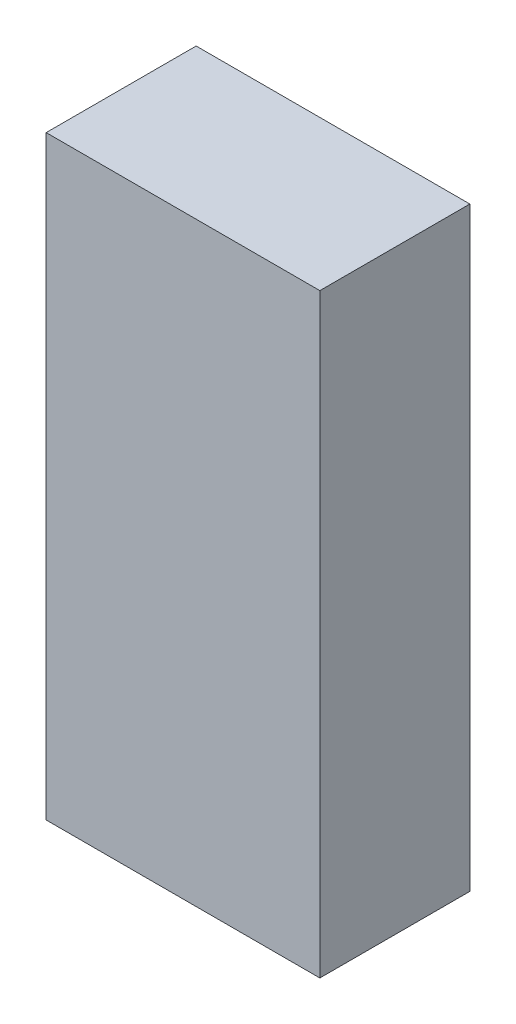
ISO-10303-21;
HEADER;
FILE_DESCRIPTION(('STEP AP214'),'2;1');
FILE_NAME('part.step','',(''),(''),'','','');
FILE_SCHEMA(('AUTOMOTIVE_DESIGN { 1 0 10303 214 1 1 1 1 }'));
ENDSEC;
DATA;
#1=APPLICATION_CONTEXT('core data for automotive mechanical design processes');
#2=APPLICATION_PROTOCOL_DEFINITION('international standard','automotive_design',2000,#1);
#3=PRODUCT_CONTEXT('',#1,'mechanical');
#4=PRODUCT('Part','Part','',(#3));
#5=PRODUCT_RELATED_PRODUCT_CATEGORY('part','',(#4));
#6=PRODUCT_DEFINITION_FORMATION('','',#4);
#7=PRODUCT_DEFINITION_CONTEXT('part definition',#1,'design');
#8=PRODUCT_DEFINITION('design','',#6,#7);
#9=PRODUCT_DEFINITION_SHAPE('','',#8);
#10=(LENGTH_UNIT() NAMED_UNIT(*) SI_UNIT(.MILLI.,.METRE.));
#11=(NAMED_UNIT(*) PLANE_ANGLE_UNIT() SI_UNIT($,.RADIAN.));
#12=(NAMED_UNIT(*) SI_UNIT($,.STERADIAN.) SOLID_ANGLE_UNIT());
#13=UNCERTAINTY_MEASURE_WITH_UNIT(LENGTH_MEASURE(1.E-05),#10,'distance_accuracy_value','');
#14=(GEOMETRIC_REPRESENTATION_CONTEXT(3) GLOBAL_UNCERTAINTY_ASSIGNED_CONTEXT((#13)) GLOBAL_UNIT_ASSIGNED_CONTEXT((#10,
#11,#12)) REPRESENTATION_CONTEXT('',''));
#15=CARTESIAN_POINT('',(0.,0.,0.));
#16=DIRECTION('',(0.,0.,1.));
#17=DIRECTION('',(1.,0.,0.));
#18=AXIS2_PLACEMENT_3D('',#15,#16,#17);
#19=CARTESIAN_POINT('',(8.85,38.5,4.85));
#20=DIRECTION('',(-1.,0.,0.));
#21=DIRECTION('',(0.,0.,1.));
#22=AXIS2_PLACEMENT_3D('',#19,#20,#21);
#23=PLANE('',#22);
#24=DIRECTION('',(0.,0.,-1.));
#25=VECTOR('',#24,1.);
#26=CARTESIAN_POINT('',(8.85,0.,4.85));
#27=LINE('',#26,#25);
#28=CARTESIAN_POINT('',(8.85,0.,4.85));
#29=VERTEX_POINT('',#28);
#30=CARTESIAN_POINT('',(8.85,0.,-4.85));
#31=VERTEX_POINT('',#30);
#32=EDGE_CURVE('E107',#29,#31,#27,.T.);
#33=ORIENTED_EDGE('',*,*,#32,.T.);
#34=DIRECTION('',(0.,-1.,0.));
#35=VECTOR('',#34,1.);
#36=CARTESIAN_POINT('',(8.85,38.5,-4.85));
#37=LINE('',#36,#35);
#38=CARTESIAN_POINT('',(8.85,38.5,-4.85));
#39=VERTEX_POINT('',#38);
#40=EDGE_CURVE('E11',#39,#31,#37,.T.);
#41=ORIENTED_EDGE('',*,*,#40,.F.);
#42=DIRECTION('',(0.,0.,-1.));
#43=VECTOR('',#42,1.);
#44=CARTESIAN_POINT('',(8.85,38.5,4.85));
#45=LINE('',#44,#43);
#46=CARTESIAN_POINT('',(8.85,38.5,4.85));
#47=VERTEX_POINT('',#46);
#48=EDGE_CURVE('E91',#47,#39,#45,.T.);
#49=ORIENTED_EDGE('',*,*,#48,.F.);
#50=DIRECTION('',(0.,-1.,0.));
#51=VECTOR('',#50,1.);
#52=CARTESIAN_POINT('',(8.85,38.5,4.85));
#53=LINE('',#52,#51);
#54=EDGE_CURVE('E103',#47,#29,#53,.T.);
#55=ORIENTED_EDGE('',*,*,#54,.T.);
#56=EDGE_LOOP('',(#33,#41,#49,#55));
#57=FACE_BOUND('',#56,.T.);
#58=ADVANCED_FACE('F39',(#57),#23,.F.);
#59=CARTESIAN_POINT('',(-8.85,38.5,-4.85));
#60=DIRECTION('',(0.,0.,1.));
#61=DIRECTION('',(1.,0.,0.));
#62=AXIS2_PLACEMENT_3D('',#59,#60,#61);
#63=PLANE('',#62);
#64=DIRECTION('',(-1.,0.,0.));
#65=VECTOR('',#64,1.);
#66=CARTESIAN_POINT('',(-8.85,0.,-4.85));
#67=LINE('',#66,#65);
#68=CARTESIAN_POINT('',(-8.85,0.,-4.85));
#69=VERTEX_POINT('',#68);
#70=EDGE_CURVE('E96',#31,#69,#67,.T.);
#71=ORIENTED_EDGE('',*,*,#70,.T.);
#72=DIRECTION('',(0.,-1.,0.));
#73=VECTOR('',#72,1.);
#74=CARTESIAN_POINT('',(-8.85,38.5,-4.85));
#75=LINE('',#74,#73);
#76=CARTESIAN_POINT('',(-8.85,38.5,-4.85));
#77=VERTEX_POINT('',#76);
#78=EDGE_CURVE('E48',#77,#69,#75,.T.);
#79=ORIENTED_EDGE('',*,*,#78,.F.);
#80=DIRECTION('',(-1.,0.,0.));
#81=VECTOR('',#80,1.);
#82=CARTESIAN_POINT('',(-8.85,38.5,-4.85));
#83=LINE('',#82,#81);
#84=EDGE_CURVE('E86',#39,#77,#83,.T.);
#85=ORIENTED_EDGE('',*,*,#84,.F.);
#86=ORIENTED_EDGE('',*,*,#40,.T.);
#87=EDGE_LOOP('',(#71,#79,#85,#86));
#88=FACE_BOUND('',#87,.T.);
#89=ADVANCED_FACE('F95',(#88),#63,.F.);
#90=CARTESIAN_POINT('',(-8.85,38.5,4.85));
#91=DIRECTION('',(1.,0.,0.));
#92=DIRECTION('',(0.,0.,-1.));
#93=AXIS2_PLACEMENT_3D('',#90,#91,#92);
#94=PLANE('',#93);
#95=DIRECTION('',(0.,0.,1.));
#96=VECTOR('',#95,1.);
#97=CARTESIAN_POINT('',(-8.85,0.,4.85));
#98=LINE('',#97,#96);
#99=CARTESIAN_POINT('',(-8.85,0.,4.85));
#100=VERTEX_POINT('',#99);
#101=EDGE_CURVE('E73',#69,#100,#98,.T.);
#102=ORIENTED_EDGE('',*,*,#101,.T.);
#103=DIRECTION('',(0.,-1.,0.));
#104=VECTOR('',#103,1.);
#105=CARTESIAN_POINT('',(-8.85,38.5,4.85));
#106=LINE('',#105,#104);
#107=CARTESIAN_POINT('',(-8.85,38.5,4.85));
#108=VERTEX_POINT('',#107);
#109=EDGE_CURVE('E98',#108,#100,#106,.T.);
#110=ORIENTED_EDGE('',*,*,#109,.F.);
#111=DIRECTION('',(0.,0.,1.));
#112=VECTOR('',#111,1.);
#113=CARTESIAN_POINT('',(-8.85,38.5,4.85));
#114=LINE('',#113,#112);
#115=EDGE_CURVE('E89',#77,#108,#114,.T.);
#116=ORIENTED_EDGE('',*,*,#115,.F.);
#117=ORIENTED_EDGE('',*,*,#78,.T.);
#118=EDGE_LOOP('',(#102,#110,#116,#117));
#119=FACE_BOUND('',#118,.T.);
#120=ADVANCED_FACE('F99',(#119),#94,.F.);
#121=CARTESIAN_POINT('',(-8.85,38.5,4.85));
#122=DIRECTION('',(0.,0.,-1.));
#123=DIRECTION('',(-1.,0.,0.));
#124=AXIS2_PLACEMENT_3D('',#121,#122,#123);
#125=PLANE('',#124);
#126=DIRECTION('',(1.,0.,0.));
#127=VECTOR('',#126,1.);
#128=CARTESIAN_POINT('',(-8.85,0.,4.85));
#129=LINE('',#128,#127);
#130=EDGE_CURVE('E79',#100,#29,#129,.T.);
#131=ORIENTED_EDGE('',*,*,#130,.T.);
#132=ORIENTED_EDGE('',*,*,#54,.F.);
#133=DIRECTION('',(1.,0.,0.));
#134=VECTOR('',#133,1.);
#135=CARTESIAN_POINT('',(-8.85,38.5,4.85));
#136=LINE('',#135,#134);
#137=EDGE_CURVE('E56',#108,#47,#136,.T.);
#138=ORIENTED_EDGE('',*,*,#137,.F.);
#139=ORIENTED_EDGE('',*,*,#109,.T.);
#140=EDGE_LOOP('',(#131,#132,#138,#139));
#141=FACE_BOUND('',#140,.T.);
#142=ADVANCED_FACE('F120',(#141),#125,.F.);
#143=CARTESIAN_POINT('',(0.,38.5,0.));
#144=DIRECTION('',(0.,-1.,0.));
#145=DIRECTION('',(0.,0.,-1.));
#146=AXIS2_PLACEMENT_3D('',#143,#144,#145);
#147=PLANE('',#146);
#148=ORIENTED_EDGE('',*,*,#48,.T.);
#149=ORIENTED_EDGE('',*,*,#84,.T.);
#150=ORIENTED_EDGE('',*,*,#115,.T.);
#151=ORIENTED_EDGE('',*,*,#137,.T.);
#152=EDGE_LOOP('',(#148,#149,#150,#151));
#153=FACE_BOUND('',#152,.T.);
#154=ADVANCED_FACE('F87',(#153),#147,.F.);
#155=CARTESIAN_POINT('',(0.,0.,0.));
#156=DIRECTION('',(0.,-1.,0.));
#157=DIRECTION('',(0.,0.,-1.));
#158=AXIS2_PLACEMENT_3D('',#155,#156,#157);
#159=PLANE('',#158);
#160=ORIENTED_EDGE('',*,*,#32,.F.);
#161=ORIENTED_EDGE('',*,*,#130,.F.);
#162=ORIENTED_EDGE('',*,*,#101,.F.);
#163=ORIENTED_EDGE('',*,*,#70,.F.);
#164=EDGE_LOOP('',(#160,#161,#162,#163));
#165=FACE_BOUND('',#164,.T.);
#166=ADVANCED_FACE('F123',(#165),#159,.T.);
#167=CLOSED_SHELL('',(#58,#89,#120,#142,#154,#166));
#168=MANIFOLD_SOLID_BREP('B2',#167);
#169=ADVANCED_BREP_SHAPE_REPRESENTATION('',(#18,#168),#14);
#170=SHAPE_DEFINITION_REPRESENTATION(#9,#169);
ENDSEC;
END-ISO-10303-21;
